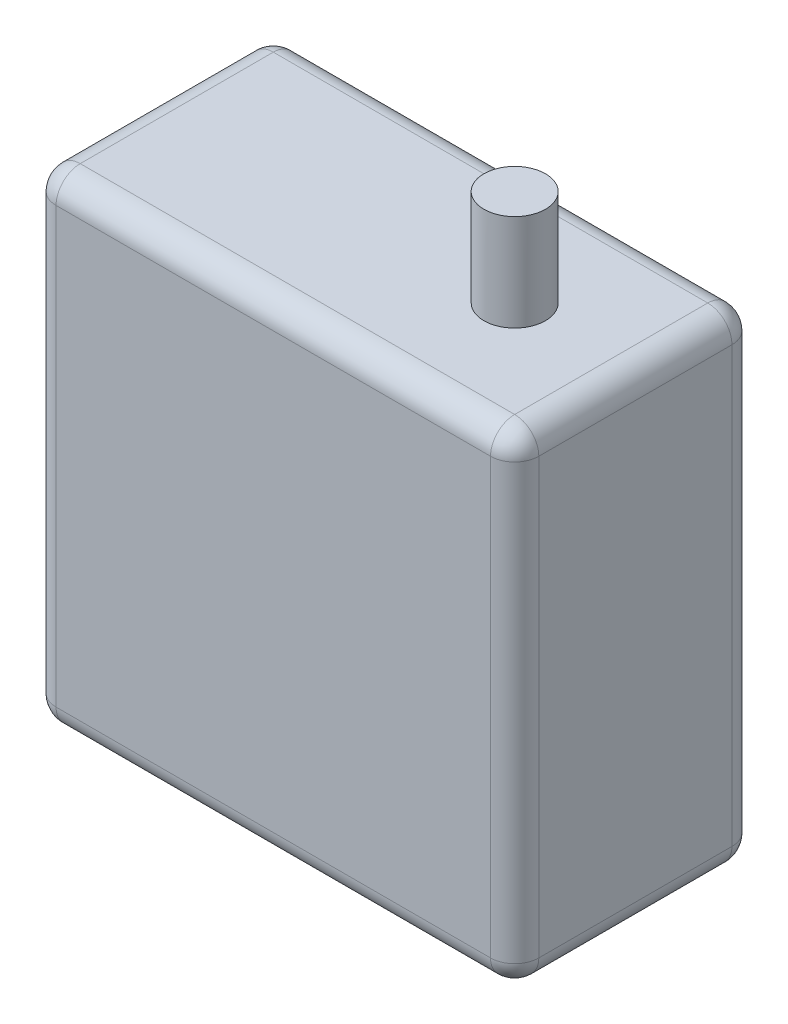
ISO-10303-21;
HEADER;
FILE_DESCRIPTION(('STEP AP214'),'2;1');
FILE_NAME('part.step','',(''),(''),'','','');
FILE_SCHEMA(('AUTOMOTIVE_DESIGN { 1 0 10303 214 1 1 1 1 }'));
ENDSEC;
DATA;
#1=APPLICATION_CONTEXT('core data for automotive mechanical design processes');
#2=APPLICATION_PROTOCOL_DEFINITION('international standard','automotive_design',2000,#1);
#3=PRODUCT_CONTEXT('',#1,'mechanical');
#4=PRODUCT('Part','Part','',(#3));
#5=PRODUCT_RELATED_PRODUCT_CATEGORY('part','',(#4));
#6=PRODUCT_DEFINITION_FORMATION('','',#4);
#7=PRODUCT_DEFINITION_CONTEXT('part definition',#1,'design');
#8=PRODUCT_DEFINITION('design','',#6,#7);
#9=PRODUCT_DEFINITION_SHAPE('','',#8);
#10=(LENGTH_UNIT() NAMED_UNIT(*) SI_UNIT(.MILLI.,.METRE.));
#11=(NAMED_UNIT(*) PLANE_ANGLE_UNIT() SI_UNIT($,.RADIAN.));
#12=(NAMED_UNIT(*) SI_UNIT($,.STERADIAN.) SOLID_ANGLE_UNIT());
#13=UNCERTAINTY_MEASURE_WITH_UNIT(LENGTH_MEASURE(1.E-05),#10,'distance_accuracy_value','');
#14=(GEOMETRIC_REPRESENTATION_CONTEXT(3) GLOBAL_UNCERTAINTY_ASSIGNED_CONTEXT((#13)) GLOBAL_UNIT_ASSIGNED_CONTEXT((#10,
#11,#12)) REPRESENTATION_CONTEXT('',''));
#15=CARTESIAN_POINT('',(0.,0.,0.));
#16=DIRECTION('',(0.,0.,1.));
#17=DIRECTION('',(1.,0.,0.));
#18=AXIS2_PLACEMENT_3D('',#15,#16,#17);
#19=CARTESIAN_POINT('',(20.,40.,10.));
#20=DIRECTION('',(-1.,0.,0.));
#21=DIRECTION('',(0.,0.,1.));
#22=AXIS2_PLACEMENT_3D('',#19,#20,#21);
#23=PLANE('',#22);
#24=DIRECTION('',(0.,0.,-1.));
#25=VECTOR('',#24,1.);
#26=CARTESIAN_POINT('',(20.,38.,10.));
#27=LINE('',#26,#25);
#28=CARTESIAN_POINT('',(20.,38.,-8.));
#29=VERTEX_POINT('',#28);
#30=CARTESIAN_POINT('',(20.,38.,8.));
#31=VERTEX_POINT('',#30);
#32=EDGE_CURVE('E66',#29,#31,#27,.F.);
#33=ORIENTED_EDGE('',*,*,#32,.T.);
#34=DIRECTION('',(0.,-1.,0.));
#35=VECTOR('',#34,1.);
#36=CARTESIAN_POINT('',(20.,40.,8.));
#37=LINE('',#36,#35);
#38=CARTESIAN_POINT('',(20.,2.,8.));
#39=VERTEX_POINT('',#38);
#40=EDGE_CURVE('E11',#31,#39,#37,.T.);
#41=ORIENTED_EDGE('',*,*,#40,.T.);
#42=DIRECTION('',(0.,0.,-1.));
#43=VECTOR('',#42,1.);
#44=CARTESIAN_POINT('',(20.,2.,-10.));
#45=LINE('',#44,#43);
#46=CARTESIAN_POINT('',(20.,2.,-8.));
#47=VERTEX_POINT('',#46);
#48=EDGE_CURVE('E55',#39,#47,#45,.T.);
#49=ORIENTED_EDGE('',*,*,#48,.T.);
#50=DIRECTION('',(0.,-1.,0.));
#51=VECTOR('',#50,1.);
#52=CARTESIAN_POINT('',(20.,40.,-8.));
#53=LINE('',#52,#51);
#54=EDGE_CURVE('E229',#47,#29,#53,.F.);
#55=ORIENTED_EDGE('',*,*,#54,.T.);
#56=EDGE_LOOP('',(#33,#41,#49,#55));
#57=FACE_BOUND('',#56,.T.);
#58=ADVANCED_FACE('F45',(#57),#23,.F.);
#59=CARTESIAN_POINT('',(-20.,40.,-10.));
#60=DIRECTION('',(0.,0.,1.));
#61=DIRECTION('',(1.,0.,0.));
#62=AXIS2_PLACEMENT_3D('',#59,#60,#61);
#63=PLANE('',#62);
#64=DIRECTION('',(-1.,0.,0.));
#65=VECTOR('',#64,1.);
#66=CARTESIAN_POINT('',(-20.,2.,-10.));
#67=LINE('',#66,#65);
#68=CARTESIAN_POINT('',(18.,2.,-10.));
#69=VERTEX_POINT('',#68);
#70=CARTESIAN_POINT('',(-18.,2.,-10.));
#71=VERTEX_POINT('',#70);
#72=EDGE_CURVE('E185',#69,#71,#67,.T.);
#73=ORIENTED_EDGE('',*,*,#72,.T.);
#74=DIRECTION('',(0.,-1.,0.));
#75=VECTOR('',#74,1.);
#76=CARTESIAN_POINT('',(-18.,40.,-10.));
#77=LINE('',#76,#75);
#78=CARTESIAN_POINT('',(-18.,38.,-10.));
#79=VERTEX_POINT('',#78);
#80=EDGE_CURVE('E141',#71,#79,#77,.F.);
#81=ORIENTED_EDGE('',*,*,#80,.T.);
#82=DIRECTION('',(-1.,0.,0.));
#83=VECTOR('',#82,1.);
#84=CARTESIAN_POINT('',(-20.,38.,-10.));
#85=LINE('',#84,#83);
#86=CARTESIAN_POINT('',(18.,38.,-10.));
#87=VERTEX_POINT('',#86);
#88=EDGE_CURVE('E178',#79,#87,#85,.F.);
#89=ORIENTED_EDGE('',*,*,#88,.T.);
#90=DIRECTION('',(0.,-1.,0.));
#91=VECTOR('',#90,1.);
#92=CARTESIAN_POINT('',(18.,40.,-10.));
#93=LINE('',#92,#91);
#94=EDGE_CURVE('E174',#87,#69,#93,.T.);
#95=ORIENTED_EDGE('',*,*,#94,.T.);
#96=EDGE_LOOP('',(#73,#81,#89,#95));
#97=FACE_BOUND('',#96,.T.);
#98=ADVANCED_FACE('F350',(#97),#63,.F.);
#99=CARTESIAN_POINT('',(-20.,40.,10.));
#100=DIRECTION('',(1.,0.,0.));
#101=DIRECTION('',(0.,0.,-1.));
#102=AXIS2_PLACEMENT_3D('',#99,#100,#101);
#103=PLANE('',#102);
#104=DIRECTION('',(0.,0.,1.));
#105=VECTOR('',#104,1.);
#106=CARTESIAN_POINT('',(-20.,38.,10.));
#107=LINE('',#106,#105);
#108=CARTESIAN_POINT('',(-20.,38.,8.));
#109=VERTEX_POINT('',#108);
#110=CARTESIAN_POINT('',(-20.,38.,-8.));
#111=VERTEX_POINT('',#110);
#112=EDGE_CURVE('E171',#109,#111,#107,.F.);
#113=ORIENTED_EDGE('',*,*,#112,.T.);
#114=DIRECTION('',(0.,-1.,0.));
#115=VECTOR('',#114,1.);
#116=CARTESIAN_POINT('',(-20.,40.,-8.));
#117=LINE('',#116,#115);
#118=CARTESIAN_POINT('',(-20.,2.,-8.));
#119=VERTEX_POINT('',#118);
#120=EDGE_CURVE('E139',#111,#119,#117,.T.);
#121=ORIENTED_EDGE('',*,*,#120,.T.);
#122=DIRECTION('',(0.,0.,1.));
#123=VECTOR('',#122,1.);
#124=CARTESIAN_POINT('',(-20.,2.,10.));
#125=LINE('',#124,#123);
#126=CARTESIAN_POINT('',(-20.,2.,8.));
#127=VERTEX_POINT('',#126);
#128=EDGE_CURVE('E159',#119,#127,#125,.T.);
#129=ORIENTED_EDGE('',*,*,#128,.T.);
#130=DIRECTION('',(0.,-1.,0.));
#131=VECTOR('',#130,1.);
#132=CARTESIAN_POINT('',(-20.,40.,8.));
#133=LINE('',#132,#131);
#134=EDGE_CURVE('E166',#127,#109,#133,.F.);
#135=ORIENTED_EDGE('',*,*,#134,.T.);
#136=EDGE_LOOP('',(#113,#121,#129,#135));
#137=FACE_BOUND('',#136,.T.);
#138=ADVANCED_FACE('F169',(#137),#103,.F.);
#139=CARTESIAN_POINT('',(-20.,40.,10.));
#140=DIRECTION('',(0.,0.,-1.));
#141=DIRECTION('',(-1.,0.,0.));
#142=AXIS2_PLACEMENT_3D('',#139,#140,#141);
#143=PLANE('',#142);
#144=DIRECTION('',(1.,0.,0.));
#145=VECTOR('',#144,1.);
#146=CARTESIAN_POINT('',(-20.,38.,10.));
#147=LINE('',#146,#145);
#148=CARTESIAN_POINT('',(18.,38.,10.));
#149=VERTEX_POINT('',#148);
#150=CARTESIAN_POINT('',(-18.,38.,10.));
#151=VERTEX_POINT('',#150);
#152=EDGE_CURVE('E206',#149,#151,#147,.F.);
#153=ORIENTED_EDGE('',*,*,#152,.T.);
#154=DIRECTION('',(0.,-1.,0.));
#155=VECTOR('',#154,1.);
#156=CARTESIAN_POINT('',(-18.,40.,10.));
#157=LINE('',#156,#155);
#158=CARTESIAN_POINT('',(-18.,2.,10.));
#159=VERTEX_POINT('',#158);
#160=EDGE_CURVE('E212',#151,#159,#157,.T.);
#161=ORIENTED_EDGE('',*,*,#160,.T.);
#162=DIRECTION('',(1.,0.,0.));
#163=VECTOR('',#162,1.);
#164=CARTESIAN_POINT('',(20.,2.,10.));
#165=LINE('',#164,#163);
#166=CARTESIAN_POINT('',(18.,2.,10.));
#167=VERTEX_POINT('',#166);
#168=EDGE_CURVE('E209',#159,#167,#165,.T.);
#169=ORIENTED_EDGE('',*,*,#168,.T.);
#170=DIRECTION('',(0.,-1.,0.));
#171=VECTOR('',#170,1.);
#172=CARTESIAN_POINT('',(18.,40.,10.));
#173=LINE('',#172,#171);
#174=EDGE_CURVE('E203',#167,#149,#173,.F.);
#175=ORIENTED_EDGE('',*,*,#174,.T.);
#176=EDGE_LOOP('',(#153,#161,#169,#175));
#177=FACE_BOUND('',#176,.T.);
#178=ADVANCED_FACE('F566',(#177),#143,.F.);
#179=CARTESIAN_POINT('',(0.,40.,0.));
#180=DIRECTION('',(0.,-1.,0.));
#181=DIRECTION('',(0.,0.,-1.));
#182=AXIS2_PLACEMENT_3D('',#179,#180,#181);
#183=PLANE('',#182);
#184=DIRECTION('',(-1.,0.,0.));
#185=VECTOR('',#184,1.);
#186=CARTESIAN_POINT('',(0.,40.,-8.));
#187=LINE('',#186,#185);
#188=CARTESIAN_POINT('',(18.,40.,-8.));
#189=VERTEX_POINT('',#188);
#190=CARTESIAN_POINT('',(-18.,40.,-8.));
#191=VERTEX_POINT('',#190);
#192=EDGE_CURVE('E193',#189,#191,#187,.T.);
#193=ORIENTED_EDGE('',*,*,#192,.T.);
#194=DIRECTION('',(0.,0.,1.));
#195=VECTOR('',#194,1.);
#196=CARTESIAN_POINT('',(-18.,40.,0.));
#197=LINE('',#196,#195);
#198=CARTESIAN_POINT('',(-18.,40.,8.));
#199=VERTEX_POINT('',#198);
#200=EDGE_CURVE('E199',#191,#199,#197,.T.);
#201=ORIENTED_EDGE('',*,*,#200,.T.);
#202=DIRECTION('',(1.,0.,0.));
#203=VECTOR('',#202,1.);
#204=CARTESIAN_POINT('',(0.,40.,8.));
#205=LINE('',#204,#203);
#206=CARTESIAN_POINT('',(18.,40.,8.));
#207=VERTEX_POINT('',#206);
#208=EDGE_CURVE('E196',#199,#207,#205,.T.);
#209=ORIENTED_EDGE('',*,*,#208,.T.);
#210=DIRECTION('',(0.,0.,-1.));
#211=VECTOR('',#210,1.);
#212=CARTESIAN_POINT('',(18.,40.,0.));
#213=LINE('',#212,#211);
#214=EDGE_CURVE('E190',#207,#189,#213,.T.);
#215=ORIENTED_EDGE('',*,*,#214,.T.);
#216=EDGE_LOOP('',(#193,#201,#209,#215));
#217=FACE_BOUND('',#216,.T.);
#218=CARTESIAN_POINT('',(10.,40.,0.));
#219=DIRECTION('',(0.,-1.,0.));
#220=DIRECTION('',(0.,0.,-1.));
#221=AXIS2_PLACEMENT_3D('',#218,#219,#220);
#222=CIRCLE('',#221,2.55);
#223=CARTESIAN_POINT('',(10.,40.,-2.55));
#224=VERTEX_POINT('',#223);
#225=EDGE_CURVE('E167',#224,#224,#222,.F.);
#226=ORIENTED_EDGE('',*,*,#225,.F.);
#227=EDGE_LOOP('',(#226));
#228=FACE_BOUND('',#227,.T.);
#229=ADVANCED_FACE('F558',(#217,#228),#183,.F.);
#230=CARTESIAN_POINT('',(0.,0.,0.));
#231=DIRECTION('',(0.,-1.,0.));
#232=DIRECTION('',(0.,0.,-1.));
#233=AXIS2_PLACEMENT_3D('',#230,#231,#232);
#234=PLANE('',#233);
#235=DIRECTION('',(0.,0.,1.));
#236=VECTOR('',#235,1.);
#237=CARTESIAN_POINT('',(-18.,0.,-10.));
#238=LINE('',#237,#236);
#239=CARTESIAN_POINT('',(-18.,0.,8.));
#240=VERTEX_POINT('',#239);
#241=CARTESIAN_POINT('',(-18.,0.,-8.));
#242=VERTEX_POINT('',#241);
#243=EDGE_CURVE('E222',#240,#242,#238,.F.);
#244=ORIENTED_EDGE('',*,*,#243,.T.);
#245=DIRECTION('',(-1.,0.,0.));
#246=VECTOR('',#245,1.);
#247=CARTESIAN_POINT('',(20.,0.,-8.));
#248=LINE('',#247,#246);
#249=CARTESIAN_POINT('',(18.,0.,-8.));
#250=VERTEX_POINT('',#249);
#251=EDGE_CURVE('E225',#242,#250,#248,.F.);
#252=ORIENTED_EDGE('',*,*,#251,.T.);
#253=DIRECTION('',(0.,0.,-1.));
#254=VECTOR('',#253,1.);
#255=CARTESIAN_POINT('',(18.,0.,10.));
#256=LINE('',#255,#254);
#257=CARTESIAN_POINT('',(18.,0.,8.));
#258=VERTEX_POINT('',#257);
#259=EDGE_CURVE('E216',#250,#258,#256,.F.);
#260=ORIENTED_EDGE('',*,*,#259,.T.);
#261=DIRECTION('',(1.,0.,0.));
#262=VECTOR('',#261,1.);
#263=CARTESIAN_POINT('',(-20.,0.,8.));
#264=LINE('',#263,#262);
#265=EDGE_CURVE('E219',#258,#240,#264,.F.);
#266=ORIENTED_EDGE('',*,*,#265,.T.);
#267=EDGE_LOOP('',(#244,#252,#260,#266));
#268=FACE_BOUND('',#267,.T.);
#269=ADVANCED_FACE('F358',(#268),#234,.T.);
#270=CARTESIAN_POINT('',(10.,48.,0.));
#271=DIRECTION('',(0.,-1.,0.));
#272=DIRECTION('',(0.,0.,-1.));
#273=AXIS2_PLACEMENT_3D('',#270,#271,#272);
#274=CYLINDRICAL_SURFACE('',#273,2.55);
#275=CARTESIAN_POINT('',(10.,48.,0.));
#276=DIRECTION('',(0.,1.,0.));
#277=DIRECTION('',(0.,0.,1.));
#278=AXIS2_PLACEMENT_3D('',#275,#276,#277);
#279=CIRCLE('',#278,2.55);
#280=CARTESIAN_POINT('',(10.,48.,2.55));
#281=VERTEX_POINT('',#280);
#282=EDGE_CURVE('E312',#281,#281,#279,.T.);
#283=ORIENTED_EDGE('',*,*,#282,.F.);
#284=EDGE_LOOP('',(#283));
#285=FACE_BOUND('',#284,.T.);
#286=ORIENTED_EDGE('',*,*,#225,.T.);
#287=EDGE_LOOP('',(#286));
#288=FACE_BOUND('',#287,.T.);
#289=ADVANCED_FACE('F542',(#285,#288),#274,.T.);
#290=CARTESIAN_POINT('',(10.,48.,0.));
#291=DIRECTION('',(0.,1.,0.));
#292=DIRECTION('',(0.,0.,1.));
#293=AXIS2_PLACEMENT_3D('',#290,#291,#292);
#294=PLANE('',#293);
#295=ORIENTED_EDGE('',*,*,#282,.T.);
#296=EDGE_LOOP('',(#295));
#297=FACE_BOUND('',#296,.T.);
#298=ADVANCED_FACE('F535',(#297),#294,.T.);
#299=CARTESIAN_POINT('',(18.,40.,8.));
#300=DIRECTION('',(0.,-1.,0.));
#301=DIRECTION('',(0.,0.,-1.));
#302=AXIS2_PLACEMENT_3D('',#299,#300,#301);
#303=CYLINDRICAL_SURFACE('',#302,2.);
#304=CARTESIAN_POINT('',(18.,38.,8.));
#305=DIRECTION('',(0.,1.,0.));
#306=DIRECTION('',(0.,0.,1.));
#307=AXIS2_PLACEMENT_3D('',#304,#305,#306);
#308=CIRCLE('',#307,2.);
#309=EDGE_CURVE('E49',#149,#31,#308,.T.);
#310=ORIENTED_EDGE('',*,*,#309,.F.);
#311=ORIENTED_EDGE('',*,*,#174,.F.);
#312=CARTESIAN_POINT('',(18.,2.,8.));
#313=DIRECTION('',(0.,-1.,0.));
#314=DIRECTION('',(0.,0.,-1.));
#315=AXIS2_PLACEMENT_3D('',#312,#313,#314);
#316=CIRCLE('',#315,2.);
#317=EDGE_CURVE('E304',#39,#167,#316,.T.);
#318=ORIENTED_EDGE('',*,*,#317,.F.);
#319=ORIENTED_EDGE('',*,*,#40,.F.);
#320=EDGE_LOOP('',(#310,#311,#318,#319));
#321=FACE_BOUND('',#320,.T.);
#322=ADVANCED_FACE('F47',(#321),#303,.T.);
#323=CARTESIAN_POINT('',(18.,38.,8.));
#324=DIRECTION('',(1.,0.,0.));
#325=DIRECTION('',(0.,0.,-1.));
#326=AXIS2_PLACEMENT_3D('',#323,#324,#325);
#327=SPHERICAL_SURFACE('',#326,2.);
#328=CARTESIAN_POINT('',(18.,38.,8.));
#329=DIRECTION('',(1.,0.,0.));
#330=DIRECTION('',(0.,0.,-1.));
#331=AXIS2_PLACEMENT_3D('',#328,#329,#330);
#332=CIRCLE('',#331,2.);
#333=EDGE_CURVE('E297',#149,#207,#332,.F.);
#334=ORIENTED_EDGE('',*,*,#333,.F.);
#335=ORIENTED_EDGE('',*,*,#309,.T.);
#336=CARTESIAN_POINT('',(18.,38.,8.));
#337=DIRECTION('',(0.,0.,1.));
#338=DIRECTION('',(1.,0.,0.));
#339=AXIS2_PLACEMENT_3D('',#336,#337,#338);
#340=CIRCLE('',#339,2.);
#341=EDGE_CURVE('E301',#207,#31,#340,.F.);
#342=ORIENTED_EDGE('',*,*,#341,.F.);
#343=EDGE_LOOP('',(#334,#335,#342));
#344=FACE_BOUND('',#343,.T.);
#345=ADVANCED_FACE('F521',(#344),#327,.T.);
#346=CARTESIAN_POINT('',(18.,2.,8.));
#347=DIRECTION('',(0.,0.,1.));
#348=DIRECTION('',(0.,-1.,0.));
#349=AXIS2_PLACEMENT_3D('',#346,#347,#348);
#350=SPHERICAL_SURFACE('',#349,2.);
#351=CARTESIAN_POINT('',(18.,2.,8.));
#352=DIRECTION('',(0.,0.,1.));
#353=DIRECTION('',(1.,0.,0.));
#354=AXIS2_PLACEMENT_3D('',#351,#352,#353);
#355=CIRCLE('',#354,2.);
#356=EDGE_CURVE('E289',#39,#258,#355,.F.);
#357=ORIENTED_EDGE('',*,*,#356,.F.);
#358=ORIENTED_EDGE('',*,*,#317,.T.);
#359=CARTESIAN_POINT('',(18.,2.,8.));
#360=DIRECTION('',(1.,0.,0.));
#361=DIRECTION('',(0.,0.,-1.));
#362=AXIS2_PLACEMENT_3D('',#359,#360,#361);
#363=CIRCLE('',#362,2.);
#364=EDGE_CURVE('E293',#258,#167,#363,.F.);
#365=ORIENTED_EDGE('',*,*,#364,.F.);
#366=EDGE_LOOP('',(#357,#358,#365));
#367=FACE_BOUND('',#366,.T.);
#368=ADVANCED_FACE('F512',(#367),#350,.T.);
#369=CARTESIAN_POINT('',(18.,38.,0.));
#370=DIRECTION('',(0.,0.,-1.));
#371=DIRECTION('',(-1.,0.,0.));
#372=AXIS2_PLACEMENT_3D('',#369,#370,#371);
#373=CYLINDRICAL_SURFACE('',#372,2.);
#374=ORIENTED_EDGE('',*,*,#341,.T.);
#375=ORIENTED_EDGE('',*,*,#32,.F.);
#376=CARTESIAN_POINT('',(18.,38.,-8.));
#377=DIRECTION('',(0.,0.,-1.));
#378=DIRECTION('',(-1.,0.,0.));
#379=AXIS2_PLACEMENT_3D('',#376,#377,#378);
#380=CIRCLE('',#379,2.);
#381=EDGE_CURVE('E281',#189,#29,#380,.T.);
#382=ORIENTED_EDGE('',*,*,#381,.F.);
#383=ORIENTED_EDGE('',*,*,#214,.F.);
#384=EDGE_LOOP('',(#374,#375,#382,#383));
#385=FACE_BOUND('',#384,.T.);
#386=ADVANCED_FACE('F503',(#385),#373,.T.);
#387=CARTESIAN_POINT('',(0.,38.,8.));
#388=DIRECTION('',(1.,0.,0.));
#389=DIRECTION('',(0.,0.,-1.));
#390=AXIS2_PLACEMENT_3D('',#387,#388,#389);
#391=CYLINDRICAL_SURFACE('',#390,2.);
#392=ORIENTED_EDGE('',*,*,#333,.T.);
#393=ORIENTED_EDGE('',*,*,#208,.F.);
#394=CARTESIAN_POINT('',(-18.,38.,8.));
#395=DIRECTION('',(-1.,0.,0.));
#396=DIRECTION('',(0.,0.,1.));
#397=AXIS2_PLACEMENT_3D('',#394,#395,#396);
#398=CIRCLE('',#397,2.);
#399=EDGE_CURVE('E277',#151,#199,#398,.T.);
#400=ORIENTED_EDGE('',*,*,#399,.F.);
#401=ORIENTED_EDGE('',*,*,#152,.F.);
#402=EDGE_LOOP('',(#392,#393,#400,#401));
#403=FACE_BOUND('',#402,.T.);
#404=ADVANCED_FACE('F495',(#403),#391,.T.);
#405=CARTESIAN_POINT('',(-18.,40.,8.));
#406=DIRECTION('',(0.,-1.,0.));
#407=DIRECTION('',(0.,0.,-1.));
#408=AXIS2_PLACEMENT_3D('',#405,#406,#407);
#409=CYLINDRICAL_SURFACE('',#408,2.);
#410=CARTESIAN_POINT('',(-18.,2.,8.));
#411=DIRECTION('',(0.,-1.,0.));
#412=DIRECTION('',(0.,0.,-1.));
#413=AXIS2_PLACEMENT_3D('',#410,#411,#412);
#414=CIRCLE('',#413,2.);
#415=EDGE_CURVE('E269',#159,#127,#414,.T.);
#416=ORIENTED_EDGE('',*,*,#415,.F.);
#417=ORIENTED_EDGE('',*,*,#160,.F.);
#418=CARTESIAN_POINT('',(-18.,38.,8.));
#419=DIRECTION('',(0.,1.,0.));
#420=DIRECTION('',(0.,0.,1.));
#421=AXIS2_PLACEMENT_3D('',#418,#419,#420);
#422=CIRCLE('',#421,2.);
#423=EDGE_CURVE('E273',#109,#151,#422,.T.);
#424=ORIENTED_EDGE('',*,*,#423,.F.);
#425=ORIENTED_EDGE('',*,*,#134,.F.);
#426=EDGE_LOOP('',(#416,#417,#424,#425));
#427=FACE_BOUND('',#426,.T.);
#428=ADVANCED_FACE('F331',(#427),#409,.T.);
#429=CARTESIAN_POINT('',(-20.,2.,8.));
#430=DIRECTION('',(-1.,0.,0.));
#431=DIRECTION('',(0.,0.,1.));
#432=AXIS2_PLACEMENT_3D('',#429,#430,#431);
#433=CYLINDRICAL_SURFACE('',#432,2.);
#434=ORIENTED_EDGE('',*,*,#364,.T.);
#435=ORIENTED_EDGE('',*,*,#168,.F.);
#436=CARTESIAN_POINT('',(-18.,2.,8.));
#437=DIRECTION('',(-1.,0.,0.));
#438=DIRECTION('',(0.,0.,1.));
#439=AXIS2_PLACEMENT_3D('',#436,#437,#438);
#440=CIRCLE('',#439,2.);
#441=EDGE_CURVE('E266',#240,#159,#440,.T.);
#442=ORIENTED_EDGE('',*,*,#441,.F.);
#443=ORIENTED_EDGE('',*,*,#265,.F.);
#444=EDGE_LOOP('',(#434,#435,#442,#443));
#445=FACE_BOUND('',#444,.T.);
#446=ADVANCED_FACE('F364',(#445),#433,.T.);
#447=CARTESIAN_POINT('',(18.,2.,10.));
#448=DIRECTION('',(0.,0.,1.));
#449=DIRECTION('',(1.,0.,0.));
#450=AXIS2_PLACEMENT_3D('',#447,#448,#449);
#451=CYLINDRICAL_SURFACE('',#450,2.);
#452=ORIENTED_EDGE('',*,*,#356,.T.);
#453=ORIENTED_EDGE('',*,*,#259,.F.);
#454=CARTESIAN_POINT('',(18.,2.,-8.));
#455=DIRECTION('',(0.,0.,-1.));
#456=DIRECTION('',(-1.,0.,0.));
#457=AXIS2_PLACEMENT_3D('',#454,#455,#456);
#458=CIRCLE('',#457,2.);
#459=EDGE_CURVE('E262',#47,#250,#458,.T.);
#460=ORIENTED_EDGE('',*,*,#459,.F.);
#461=ORIENTED_EDGE('',*,*,#48,.F.);
#462=EDGE_LOOP('',(#452,#453,#460,#461));
#463=FACE_BOUND('',#462,.T.);
#464=ADVANCED_FACE('F471',(#463),#451,.T.);
#465=CARTESIAN_POINT('',(18.,40.,-8.));
#466=DIRECTION('',(0.,-1.,0.));
#467=DIRECTION('',(0.,0.,-1.));
#468=AXIS2_PLACEMENT_3D('',#465,#466,#467);
#469=CYLINDRICAL_SURFACE('',#468,2.);
#470=CARTESIAN_POINT('',(18.,38.,-8.));
#471=DIRECTION('',(0.,1.,0.));
#472=DIRECTION('',(0.,0.,1.));
#473=AXIS2_PLACEMENT_3D('',#470,#471,#472);
#474=CIRCLE('',#473,2.);
#475=EDGE_CURVE('E285',#29,#87,#474,.T.);
#476=ORIENTED_EDGE('',*,*,#475,.F.);
#477=ORIENTED_EDGE('',*,*,#54,.F.);
#478=CARTESIAN_POINT('',(18.,2.,-8.));
#479=DIRECTION('',(0.,-1.,0.));
#480=DIRECTION('',(0.,0.,-1.));
#481=AXIS2_PLACEMENT_3D('',#478,#479,#480);
#482=CIRCLE('',#481,2.);
#483=EDGE_CURVE('E259',#69,#47,#482,.T.);
#484=ORIENTED_EDGE('',*,*,#483,.F.);
#485=ORIENTED_EDGE('',*,*,#94,.F.);
#486=EDGE_LOOP('',(#476,#477,#484,#485));
#487=FACE_BOUND('',#486,.T.);
#488=ADVANCED_FACE('F462',(#487),#469,.T.);
#489=CARTESIAN_POINT('',(18.,38.,-8.));
#490=DIRECTION('',(1.,0.,0.));
#491=DIRECTION('',(0.,0.,-1.));
#492=AXIS2_PLACEMENT_3D('',#489,#490,#491);
#493=SPHERICAL_SURFACE('',#492,2.);
#494=ORIENTED_EDGE('',*,*,#381,.T.);
#495=ORIENTED_EDGE('',*,*,#475,.T.);
#496=CARTESIAN_POINT('',(18.,38.,-8.));
#497=DIRECTION('',(1.,0.,0.));
#498=DIRECTION('',(0.,0.,-1.));
#499=AXIS2_PLACEMENT_3D('',#496,#497,#498);
#500=CIRCLE('',#499,2.);
#501=EDGE_CURVE('E255',#189,#87,#500,.F.);
#502=ORIENTED_EDGE('',*,*,#501,.F.);
#503=EDGE_LOOP('',(#494,#495,#502));
#504=FACE_BOUND('',#503,.T.);
#505=ADVANCED_FACE('F376',(#504),#493,.T.);
#506=CARTESIAN_POINT('',(-18.,38.,8.));
#507=DIRECTION('',(0.,0.,1.));
#508=DIRECTION('',(1.,0.,0.));
#509=AXIS2_PLACEMENT_3D('',#506,#507,#508);
#510=SPHERICAL_SURFACE('',#509,2.);
#511=ORIENTED_EDGE('',*,*,#423,.T.);
#512=ORIENTED_EDGE('',*,*,#399,.T.);
#513=CARTESIAN_POINT('',(-18.,38.,8.));
#514=DIRECTION('',(0.,0.,1.));
#515=DIRECTION('',(1.,0.,0.));
#516=AXIS2_PLACEMENT_3D('',#513,#514,#515);
#517=CIRCLE('',#516,2.);
#518=EDGE_CURVE('E252',#109,#199,#517,.F.);
#519=ORIENTED_EDGE('',*,*,#518,.F.);
#520=EDGE_LOOP('',(#511,#512,#519));
#521=FACE_BOUND('',#520,.T.);
#522=ADVANCED_FACE('F334',(#521),#510,.T.);
#523=CARTESIAN_POINT('',(-18.,2.,8.));
#524=DIRECTION('',(0.,0.,1.));
#525=DIRECTION('',(0.,-1.,0.));
#526=AXIS2_PLACEMENT_3D('',#523,#524,#525);
#527=SPHERICAL_SURFACE('',#526,2.);
#528=ORIENTED_EDGE('',*,*,#441,.T.);
#529=ORIENTED_EDGE('',*,*,#415,.T.);
#530=CARTESIAN_POINT('',(-18.,2.,8.));
#531=DIRECTION('',(0.,0.,1.));
#532=DIRECTION('',(1.,0.,0.));
#533=AXIS2_PLACEMENT_3D('',#530,#531,#532);
#534=CIRCLE('',#533,2.);
#535=EDGE_CURVE('E162',#240,#127,#534,.F.);
#536=ORIENTED_EDGE('',*,*,#535,.F.);
#537=EDGE_LOOP('',(#528,#529,#536));
#538=FACE_BOUND('',#537,.T.);
#539=ADVANCED_FACE('F366',(#538),#527,.T.);
#540=CARTESIAN_POINT('',(18.,2.,-8.));
#541=DIRECTION('',(1.,0.,0.));
#542=DIRECTION('',(0.,1.,0.));
#543=AXIS2_PLACEMENT_3D('',#540,#541,#542);
#544=SPHERICAL_SURFACE('',#543,2.);
#545=ORIENTED_EDGE('',*,*,#483,.T.);
#546=ORIENTED_EDGE('',*,*,#459,.T.);
#547=CARTESIAN_POINT('',(18.,2.,-8.));
#548=DIRECTION('',(1.,0.,0.));
#549=DIRECTION('',(0.,0.,-1.));
#550=AXIS2_PLACEMENT_3D('',#547,#548,#549);
#551=CIRCLE('',#550,2.);
#552=EDGE_CURVE('E247',#69,#250,#551,.F.);
#553=ORIENTED_EDGE('',*,*,#552,.F.);
#554=EDGE_LOOP('',(#545,#546,#553));
#555=FACE_BOUND('',#554,.T.);
#556=ADVANCED_FACE('F368',(#555),#544,.T.);
#557=CARTESIAN_POINT('',(0.,38.,-8.));
#558=DIRECTION('',(-1.,0.,0.));
#559=DIRECTION('',(0.,0.,1.));
#560=AXIS2_PLACEMENT_3D('',#557,#558,#559);
#561=CYLINDRICAL_SURFACE('',#560,2.);
#562=ORIENTED_EDGE('',*,*,#501,.T.);
#563=ORIENTED_EDGE('',*,*,#88,.F.);
#564=CARTESIAN_POINT('',(-18.,38.,-8.));
#565=DIRECTION('',(-1.,0.,0.));
#566=DIRECTION('',(0.,0.,1.));
#567=AXIS2_PLACEMENT_3D('',#564,#565,#566);
#568=CIRCLE('',#567,2.);
#569=EDGE_CURVE('E243',#191,#79,#568,.T.);
#570=ORIENTED_EDGE('',*,*,#569,.F.);
#571=ORIENTED_EDGE('',*,*,#192,.F.);
#572=EDGE_LOOP('',(#562,#563,#570,#571));
#573=FACE_BOUND('',#572,.T.);
#574=ADVANCED_FACE('F346',(#573),#561,.T.);
#575=CARTESIAN_POINT('',(-18.,38.,0.));
#576=DIRECTION('',(0.,0.,1.));
#577=DIRECTION('',(1.,0.,0.));
#578=AXIS2_PLACEMENT_3D('',#575,#576,#577);
#579=CYLINDRICAL_SURFACE('',#578,2.);
#580=ORIENTED_EDGE('',*,*,#518,.T.);
#581=ORIENTED_EDGE('',*,*,#200,.F.);
#582=CARTESIAN_POINT('',(-18.,38.,-8.));
#583=DIRECTION('',(0.,0.,-1.));
#584=DIRECTION('',(0.,1.,0.));
#585=AXIS2_PLACEMENT_3D('',#582,#583,#584);
#586=CIRCLE('',#585,2.);
#587=EDGE_CURVE('E156',#111,#191,#586,.T.);
#588=ORIENTED_EDGE('',*,*,#587,.F.);
#589=ORIENTED_EDGE('',*,*,#112,.F.);
#590=EDGE_LOOP('',(#580,#581,#588,#589));
#591=FACE_BOUND('',#590,.T.);
#592=ADVANCED_FACE('F338',(#591),#579,.T.);
#593=CARTESIAN_POINT('',(-18.,2.,10.));
#594=DIRECTION('',(0.,0.,-1.));
#595=DIRECTION('',(-1.,0.,0.));
#596=AXIS2_PLACEMENT_3D('',#593,#594,#595);
#597=CYLINDRICAL_SURFACE('',#596,2.);
#598=ORIENTED_EDGE('',*,*,#535,.T.);
#599=ORIENTED_EDGE('',*,*,#128,.F.);
#600=CARTESIAN_POINT('',(-18.,2.,-8.));
#601=DIRECTION('',(0.,0.,-1.));
#602=DIRECTION('',(-1.,0.,0.));
#603=AXIS2_PLACEMENT_3D('',#600,#601,#602);
#604=CIRCLE('',#603,2.);
#605=EDGE_CURVE('E148',#242,#119,#604,.T.);
#606=ORIENTED_EDGE('',*,*,#605,.F.);
#607=ORIENTED_EDGE('',*,*,#243,.F.);
#608=EDGE_LOOP('',(#598,#599,#606,#607));
#609=FACE_BOUND('',#608,.T.);
#610=ADVANCED_FACE('F160',(#609),#597,.T.);
#611=CARTESIAN_POINT('',(-20.,2.,-8.));
#612=DIRECTION('',(1.,0.,0.));
#613=DIRECTION('',(0.,0.,-1.));
#614=AXIS2_PLACEMENT_3D('',#611,#612,#613);
#615=CYLINDRICAL_SURFACE('',#614,2.);
#616=ORIENTED_EDGE('',*,*,#552,.T.);
#617=ORIENTED_EDGE('',*,*,#251,.F.);
#618=CARTESIAN_POINT('',(-18.,2.,-8.));
#619=DIRECTION('',(-1.,0.,0.));
#620=DIRECTION('',(0.,0.,1.));
#621=AXIS2_PLACEMENT_3D('',#618,#619,#620);
#622=CIRCLE('',#621,2.);
#623=EDGE_CURVE('E152',#71,#242,#622,.T.);
#624=ORIENTED_EDGE('',*,*,#623,.F.);
#625=ORIENTED_EDGE('',*,*,#72,.F.);
#626=EDGE_LOOP('',(#616,#617,#624,#625));
#627=FACE_BOUND('',#626,.T.);
#628=ADVANCED_FACE('F355',(#627),#615,.T.);
#629=CARTESIAN_POINT('',(-18.,38.,-8.));
#630=DIRECTION('',(0.,1.,0.));
#631=DIRECTION('',(0.,0.,1.));
#632=AXIS2_PLACEMENT_3D('',#629,#630,#631);
#633=SPHERICAL_SURFACE('',#632,2.);
#634=ORIENTED_EDGE('',*,*,#587,.T.);
#635=ORIENTED_EDGE('',*,*,#569,.T.);
#636=CARTESIAN_POINT('',(-18.,38.,-8.));
#637=DIRECTION('',(0.,1.,0.));
#638=DIRECTION('',(0.,0.,1.));
#639=AXIS2_PLACEMENT_3D('',#636,#637,#638);
#640=CIRCLE('',#639,2.);
#641=EDGE_CURVE('E145',#111,#79,#640,.F.);
#642=ORIENTED_EDGE('',*,*,#641,.F.);
#643=EDGE_LOOP('',(#634,#635,#642));
#644=FACE_BOUND('',#643,.T.);
#645=ADVANCED_FACE('F342',(#644),#633,.T.);
#646=CARTESIAN_POINT('',(-18.,2.,-8.));
#647=DIRECTION('',(0.,-1.,0.));
#648=DIRECTION('',(0.,0.,-1.));
#649=AXIS2_PLACEMENT_3D('',#646,#647,#648);
#650=SPHERICAL_SURFACE('',#649,2.);
#651=ORIENTED_EDGE('',*,*,#623,.T.);
#652=ORIENTED_EDGE('',*,*,#605,.T.);
#653=CARTESIAN_POINT('',(-18.,2.,-8.));
#654=DIRECTION('',(0.,-1.,0.));
#655=DIRECTION('',(0.,0.,-1.));
#656=AXIS2_PLACEMENT_3D('',#653,#654,#655);
#657=CIRCLE('',#656,2.);
#658=EDGE_CURVE('E135',#71,#119,#657,.F.);
#659=ORIENTED_EDGE('',*,*,#658,.F.);
#660=EDGE_LOOP('',(#651,#652,#659));
#661=FACE_BOUND('',#660,.T.);
#662=ADVANCED_FACE('F150',(#661),#650,.T.);
#663=CARTESIAN_POINT('',(-18.,40.,-8.));
#664=DIRECTION('',(0.,-1.,0.));
#665=DIRECTION('',(0.,0.,-1.));
#666=AXIS2_PLACEMENT_3D('',#663,#664,#665);
#667=CYLINDRICAL_SURFACE('',#666,2.);
#668=ORIENTED_EDGE('',*,*,#641,.T.);
#669=ORIENTED_EDGE('',*,*,#80,.F.);
#670=ORIENTED_EDGE('',*,*,#658,.T.);
#671=ORIENTED_EDGE('',*,*,#120,.F.);
#672=EDGE_LOOP('',(#668,#669,#670,#671));
#673=FACE_BOUND('',#672,.T.);
#674=ADVANCED_FACE('F137',(#673),#667,.T.);
#675=CLOSED_SHELL('',(#58,#98,#138,#178,#229,#269,#289,#298,#322,#345,#368,#386,#404,#428,#446,
#464,#488,#505,#522,#539,#556,#574,#592,#610,#628,#645,#662,#674));
#676=MANIFOLD_SOLID_BREP('B2',#675);
#677=ADVANCED_BREP_SHAPE_REPRESENTATION('',(#18,#676),#14);
#678=SHAPE_DEFINITION_REPRESENTATION(#9,#677);
ENDSEC;
END-ISO-10303-21;
